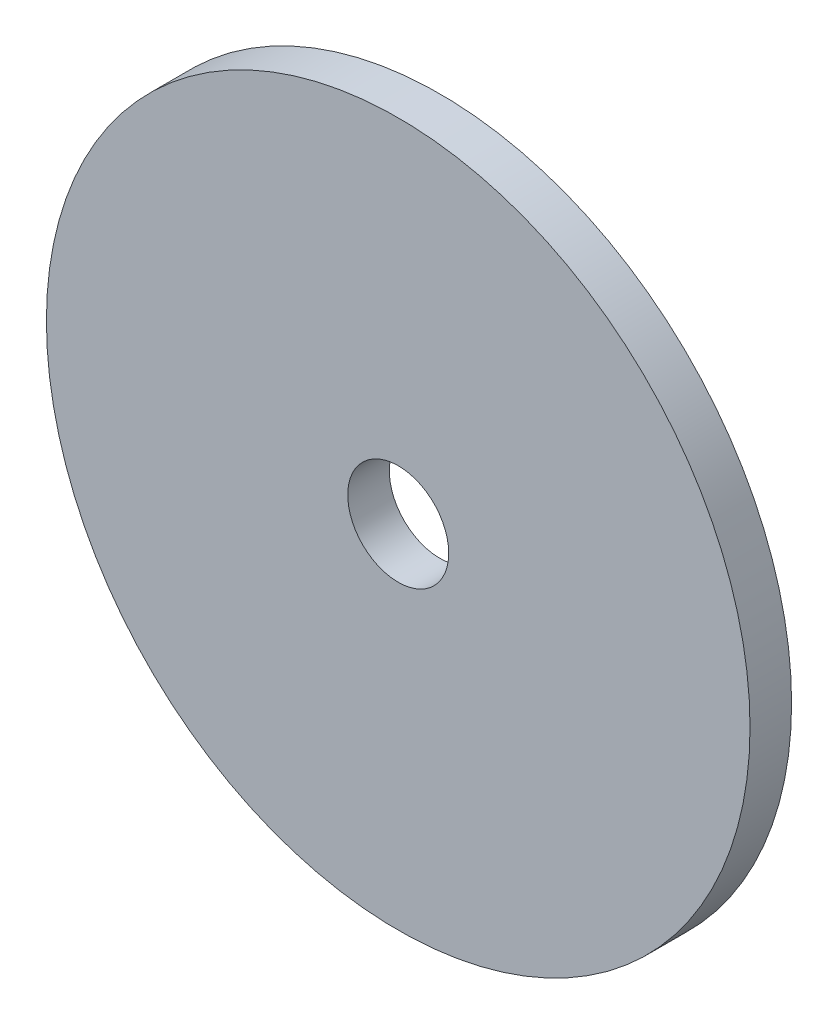
ISO-10303-21;
HEADER;
FILE_DESCRIPTION(('STEP AP214'),'2;1');
FILE_NAME('part.step','',(''),(''),'','','');
FILE_SCHEMA(('AUTOMOTIVE_DESIGN { 1 0 10303 214 1 1 1 1 }'));
ENDSEC;
DATA;
#1=APPLICATION_CONTEXT('core data for automotive mechanical design processes');
#2=APPLICATION_PROTOCOL_DEFINITION('international standard','automotive_design',2000,#1);
#3=PRODUCT_CONTEXT('',#1,'mechanical');
#4=PRODUCT('Part','Part','',(#3));
#5=PRODUCT_RELATED_PRODUCT_CATEGORY('part','',(#4));
#6=PRODUCT_DEFINITION_FORMATION('','',#4);
#7=PRODUCT_DEFINITION_CONTEXT('part definition',#1,'design');
#8=PRODUCT_DEFINITION('design','',#6,#7);
#9=PRODUCT_DEFINITION_SHAPE('','',#8);
#10=(LENGTH_UNIT() NAMED_UNIT(*) SI_UNIT(.MILLI.,.METRE.));
#11=(NAMED_UNIT(*) PLANE_ANGLE_UNIT() SI_UNIT($,.RADIAN.));
#12=(NAMED_UNIT(*) SI_UNIT($,.STERADIAN.) SOLID_ANGLE_UNIT());
#13=UNCERTAINTY_MEASURE_WITH_UNIT(LENGTH_MEASURE(1.E-05),#10,'distance_accuracy_value','');
#14=(GEOMETRIC_REPRESENTATION_CONTEXT(3) GLOBAL_UNCERTAINTY_ASSIGNED_CONTEXT((#13)) GLOBAL_UNIT_ASSIGNED_CONTEXT((#10,
#11,#12)) REPRESENTATION_CONTEXT('',''));
#15=CARTESIAN_POINT('',(0.,0.,0.));
#16=DIRECTION('',(0.,0.,1.));
#17=DIRECTION('',(1.,0.,0.));
#18=AXIS2_PLACEMENT_3D('',#15,#16,#17);
#19=CARTESIAN_POINT('',(0.,0.,3.));
#20=DIRECTION('',(0.,0.,-1.));
#21=DIRECTION('',(-1.,0.,0.));
#22=AXIS2_PLACEMENT_3D('',#19,#20,#21);
#23=CYLINDRICAL_SURFACE('',#22,25.4);
#24=CARTESIAN_POINT('',(0.,0.,3.));
#25=DIRECTION('',(0.,0.,1.));
#26=DIRECTION('',(1.,0.,0.));
#27=AXIS2_PLACEMENT_3D('',#24,#25,#26);
#28=CIRCLE('',#27,25.4);
#29=CARTESIAN_POINT('',(25.4,0.,3.));
#30=VERTEX_POINT('',#29);
#31=EDGE_CURVE('E10',#30,#30,#28,.T.);
#32=ORIENTED_EDGE('',*,*,#31,.F.);
#33=EDGE_LOOP('',(#32));
#34=FACE_BOUND('',#33,.T.);
#35=CARTESIAN_POINT('',(0.,0.,0.));
#36=DIRECTION('',(0.,0.,1.));
#37=DIRECTION('',(1.,0.,0.));
#38=AXIS2_PLACEMENT_3D('',#35,#36,#37);
#39=CIRCLE('',#38,25.4);
#40=CARTESIAN_POINT('',(25.4,0.,0.));
#41=VERTEX_POINT('',#40);
#42=EDGE_CURVE('E40',#41,#41,#39,.T.);
#43=ORIENTED_EDGE('',*,*,#42,.T.);
#44=EDGE_LOOP('',(#43));
#45=FACE_BOUND('',#44,.T.);
#46=ADVANCED_FACE('F37',(#34,#45),#23,.T.);
#47=CARTESIAN_POINT('',(0.,0.,3.));
#48=DIRECTION('',(0.,0.,1.));
#49=DIRECTION('',(1.,0.,0.));
#50=AXIS2_PLACEMENT_3D('',#47,#48,#49);
#51=PLANE('',#50);
#52=CARTESIAN_POINT('',(0.,0.,3.));
#53=DIRECTION('',(0.,0.,1.));
#54=DIRECTION('',(1.,0.,0.));
#55=AXIS2_PLACEMENT_3D('',#52,#53,#54);
#56=CIRCLE('',#55,3.6449);
#57=CARTESIAN_POINT('',(3.6449,0.,3.));
#58=VERTEX_POINT('',#57);
#59=EDGE_CURVE('E49',#58,#58,#56,.T.);
#60=ORIENTED_EDGE('',*,*,#59,.F.);
#61=EDGE_LOOP('',(#60));
#62=FACE_BOUND('',#61,.T.);
#63=ORIENTED_EDGE('',*,*,#31,.T.);
#64=EDGE_LOOP('',(#63));
#65=FACE_BOUND('',#64,.T.);
#66=ADVANCED_FACE('F64',(#62,#65),#51,.T.);
#67=CARTESIAN_POINT('',(0.,0.,0.));
#68=DIRECTION('',(0.,0.,1.));
#69=DIRECTION('',(1.,0.,0.));
#70=AXIS2_PLACEMENT_3D('',#67,#68,#69);
#71=PLANE('',#70);
#72=CARTESIAN_POINT('',(0.,0.,0.));
#73=DIRECTION('',(0.,0.,1.));
#74=DIRECTION('',(1.,0.,0.));
#75=AXIS2_PLACEMENT_3D('',#72,#73,#74);
#76=CIRCLE('',#75,3.6449);
#77=CARTESIAN_POINT('',(3.6449,0.,0.));
#78=VERTEX_POINT('',#77);
#79=EDGE_CURVE('E47',#78,#78,#76,.T.);
#80=ORIENTED_EDGE('',*,*,#79,.T.);
#81=EDGE_LOOP('',(#80));
#82=FACE_BOUND('',#81,.T.);
#83=ORIENTED_EDGE('',*,*,#42,.F.);
#84=EDGE_LOOP('',(#83));
#85=FACE_BOUND('',#84,.T.);
#86=ADVANCED_FACE('F55',(#82,#85),#71,.F.);
#87=CARTESIAN_POINT('',(0.,0.,0.));
#88=DIRECTION('',(0.,0.,1.));
#89=DIRECTION('',(1.,0.,0.));
#90=AXIS2_PLACEMENT_3D('',#87,#88,#89);
#91=CYLINDRICAL_SURFACE('',#90,3.6449);
#92=ORIENTED_EDGE('',*,*,#79,.F.);
#93=EDGE_LOOP('',(#92));
#94=FACE_BOUND('',#93,.T.);
#95=ORIENTED_EDGE('',*,*,#59,.T.);
#96=EDGE_LOOP('',(#95));
#97=FACE_BOUND('',#96,.T.);
#98=ADVANCED_FACE('F58',(#94,#97),#91,.F.);
#99=CLOSED_SHELL('',(#46,#66,#86,#98));
#100=MANIFOLD_SOLID_BREP('B2',#99);
#101=ADVANCED_BREP_SHAPE_REPRESENTATION('',(#18,#100),#14);
#102=SHAPE_DEFINITION_REPRESENTATION(#9,#101);
ENDSEC;
END-ISO-10303-21;
